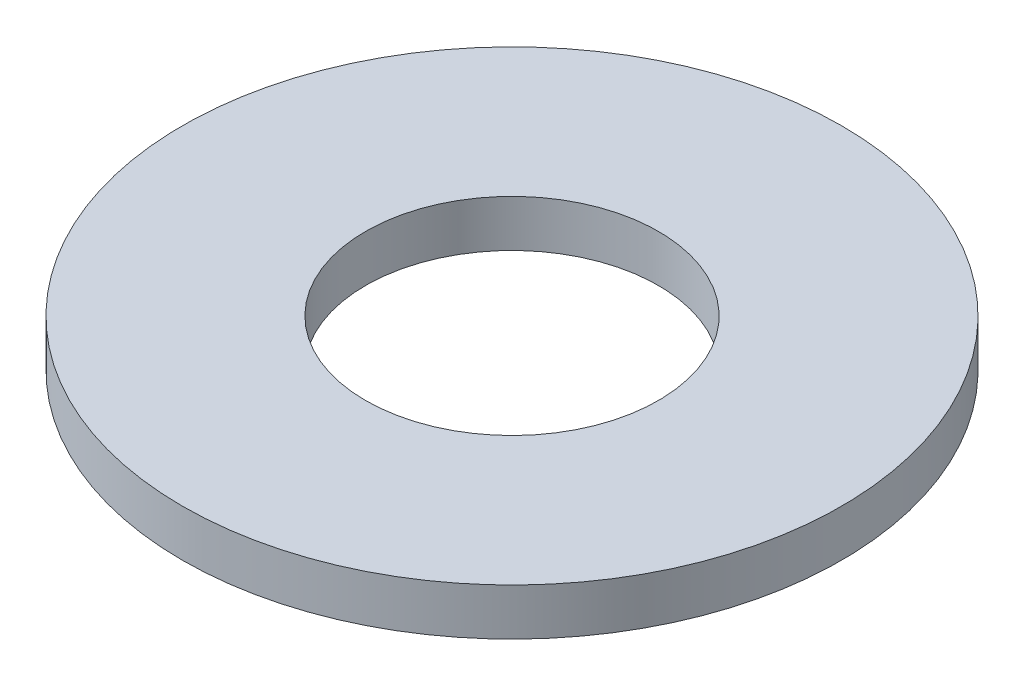
ISO-10303-21;
HEADER;
FILE_DESCRIPTION(('STEP AP214'),'2;1');
FILE_NAME('part.step','',(''),(''),'','','');
FILE_SCHEMA(('AUTOMOTIVE_DESIGN { 1 0 10303 214 1 1 1 1 }'));
ENDSEC;
DATA;
#1=APPLICATION_CONTEXT('core data for automotive mechanical design processes');
#2=APPLICATION_PROTOCOL_DEFINITION('international standard','automotive_design',2000,#1);
#3=PRODUCT_CONTEXT('',#1,'mechanical');
#4=PRODUCT('Part','Part','',(#3));
#5=PRODUCT_RELATED_PRODUCT_CATEGORY('part','',(#4));
#6=PRODUCT_DEFINITION_FORMATION('','',#4);
#7=PRODUCT_DEFINITION_CONTEXT('part definition',#1,'design');
#8=PRODUCT_DEFINITION('design','',#6,#7);
#9=PRODUCT_DEFINITION_SHAPE('','',#8);
#10=(LENGTH_UNIT() NAMED_UNIT(*) SI_UNIT(.MILLI.,.METRE.));
#11=(NAMED_UNIT(*) PLANE_ANGLE_UNIT() SI_UNIT($,.RADIAN.));
#12=(NAMED_UNIT(*) SI_UNIT($,.STERADIAN.) SOLID_ANGLE_UNIT());
#13=UNCERTAINTY_MEASURE_WITH_UNIT(LENGTH_MEASURE(1.E-05),#10,'distance_accuracy_value','');
#14=(GEOMETRIC_REPRESENTATION_CONTEXT(3) GLOBAL_UNCERTAINTY_ASSIGNED_CONTEXT((#13)) GLOBAL_UNIT_ASSIGNED_CONTEXT((#10,
#11,#12)) REPRESENTATION_CONTEXT('',''));
#15=CARTESIAN_POINT('',(0.,0.,0.));
#16=DIRECTION('',(0.,0.,1.));
#17=DIRECTION('',(1.,0.,0.));
#18=AXIS2_PLACEMENT_3D('',#15,#16,#17);
#19=CARTESIAN_POINT('',(0.,1.016,0.));
#20=DIRECTION('',(0.,1.,0.));
#21=DIRECTION('',(0.,0.,1.));
#22=AXIS2_PLACEMENT_3D('',#19,#20,#21);
#23=PLANE('',#22);
#24=CARTESIAN_POINT('',(0.,1.016,0.));
#25=DIRECTION('',(0.,1.,0.));
#26=DIRECTION('',(0.,0.,1.));
#27=AXIS2_PLACEMENT_3D('',#24,#25,#26);
#28=CIRCLE('',#27,7.14375);
#29=CARTESIAN_POINT('',(0.,1.016,7.14375));
#30=VERTEX_POINT('',#29);
#31=EDGE_CURVE('E10',#30,#30,#28,.T.);
#32=ORIENTED_EDGE('',*,*,#31,.T.);
#33=EDGE_LOOP('',(#32));
#34=FACE_BOUND('',#33,.T.);
#35=CARTESIAN_POINT('',(0.,1.016,0.));
#36=DIRECTION('',(0.,1.,0.));
#37=DIRECTION('',(0.,0.,1.));
#38=AXIS2_PLACEMENT_3D('',#35,#36,#37);
#39=CIRCLE('',#38,3.175);
#40=CARTESIAN_POINT('',(0.,1.016,3.175));
#41=VERTEX_POINT('',#40);
#42=EDGE_CURVE('E41',#41,#41,#39,.T.);
#43=ORIENTED_EDGE('',*,*,#42,.F.);
#44=EDGE_LOOP('',(#43));
#45=FACE_BOUND('',#44,.T.);
#46=ADVANCED_FACE('F30',(#34,#45),#23,.T.);
#47=CARTESIAN_POINT('',(0.,0.,0.));
#48=DIRECTION('',(0.,1.,0.));
#49=DIRECTION('',(0.,0.,1.));
#50=AXIS2_PLACEMENT_3D('',#47,#48,#49);
#51=PLANE('',#50);
#52=CARTESIAN_POINT('',(0.,0.,0.));
#53=DIRECTION('',(0.,1.,0.));
#54=DIRECTION('',(0.,0.,1.));
#55=AXIS2_PLACEMENT_3D('',#52,#53,#54);
#56=CIRCLE('',#55,7.14375);
#57=CARTESIAN_POINT('',(0.,0.,7.14375));
#58=VERTEX_POINT('',#57);
#59=EDGE_CURVE('E34',#58,#58,#56,.T.);
#60=ORIENTED_EDGE('',*,*,#59,.F.);
#61=EDGE_LOOP('',(#60));
#62=FACE_BOUND('',#61,.T.);
#63=CARTESIAN_POINT('',(0.,0.,0.));
#64=DIRECTION('',(0.,1.,0.));
#65=DIRECTION('',(0.,0.,1.));
#66=AXIS2_PLACEMENT_3D('',#63,#64,#65);
#67=CIRCLE('',#66,3.175);
#68=CARTESIAN_POINT('',(0.,0.,3.175));
#69=VERTEX_POINT('',#68);
#70=EDGE_CURVE('E43',#69,#69,#67,.T.);
#71=ORIENTED_EDGE('',*,*,#70,.T.);
#72=EDGE_LOOP('',(#71));
#73=FACE_BOUND('',#72,.T.);
#74=ADVANCED_FACE('F53',(#62,#73),#51,.F.);
#75=CARTESIAN_POINT('',(0.,1.016,0.));
#76=DIRECTION('',(0.,-1.,0.));
#77=DIRECTION('',(0.,0.,-1.));
#78=AXIS2_PLACEMENT_3D('',#75,#76,#77);
#79=CYLINDRICAL_SURFACE('',#78,7.14375);
#80=ORIENTED_EDGE('',*,*,#31,.F.);
#81=EDGE_LOOP('',(#80));
#82=FACE_BOUND('',#81,.T.);
#83=ORIENTED_EDGE('',*,*,#59,.T.);
#84=EDGE_LOOP('',(#83));
#85=FACE_BOUND('',#84,.T.);
#86=ADVANCED_FACE('F32',(#82,#85),#79,.T.);
#87=CARTESIAN_POINT('',(0.,1.016,0.));
#88=DIRECTION('',(0.,-1.,0.));
#89=DIRECTION('',(0.,0.,-1.));
#90=AXIS2_PLACEMENT_3D('',#87,#88,#89);
#91=CYLINDRICAL_SURFACE('',#90,3.175);
#92=ORIENTED_EDGE('',*,*,#42,.T.);
#93=EDGE_LOOP('',(#92));
#94=FACE_BOUND('',#93,.T.);
#95=ORIENTED_EDGE('',*,*,#70,.F.);
#96=EDGE_LOOP('',(#95));
#97=FACE_BOUND('',#96,.T.);
#98=ADVANCED_FACE('F49',(#94,#97),#91,.F.);
#99=CLOSED_SHELL('',(#46,#74,#86,#98));
#100=MANIFOLD_SOLID_BREP('B2',#99);
#101=ADVANCED_BREP_SHAPE_REPRESENTATION('',(#18,#100),#14);
#102=SHAPE_DEFINITION_REPRESENTATION(#9,#101);
ENDSEC;
END-ISO-10303-21;
